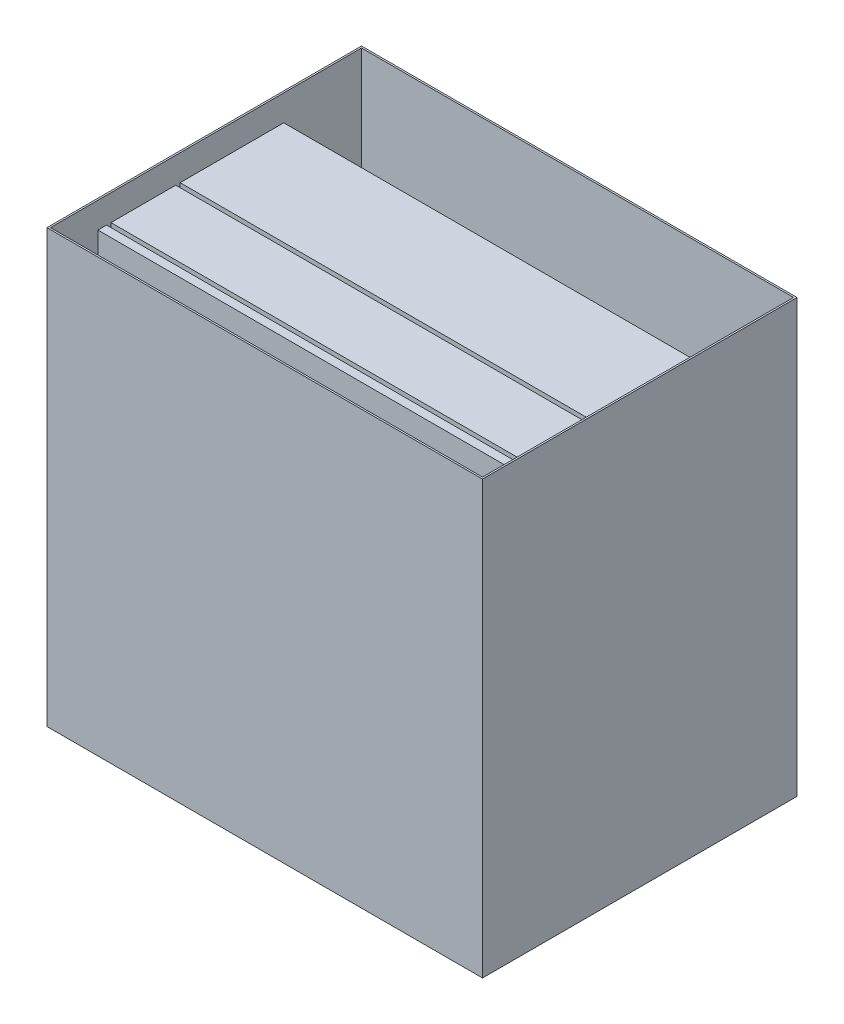
ISO-10303-21;
HEADER;
FILE_DESCRIPTION(('STEP AP214'),'2;1');
FILE_NAME('part.step','',(''),(''),'','','');
FILE_SCHEMA(('AUTOMOTIVE_DESIGN { 1 0 10303 214 1 1 1 1 }'));
ENDSEC;
DATA;
#1=APPLICATION_CONTEXT('core data for automotive mechanical design processes');
#2=APPLICATION_PROTOCOL_DEFINITION('international standard','automotive_design',2000,#1);
#3=PRODUCT_CONTEXT('',#1,'mechanical');
#4=PRODUCT('Part','Part','',(#3));
#5=PRODUCT_RELATED_PRODUCT_CATEGORY('part','',(#4));
#6=PRODUCT_DEFINITION_FORMATION('','',#4);
#7=PRODUCT_DEFINITION_CONTEXT('part definition',#1,'design');
#8=PRODUCT_DEFINITION('design','',#6,#7);
#9=PRODUCT_DEFINITION_SHAPE('','',#8);
#10=(LENGTH_UNIT() NAMED_UNIT(*) SI_UNIT(.MILLI.,.METRE.));
#11=(NAMED_UNIT(*) PLANE_ANGLE_UNIT() SI_UNIT($,.RADIAN.));
#12=(NAMED_UNIT(*) SI_UNIT($,.STERADIAN.) SOLID_ANGLE_UNIT());
#13=UNCERTAINTY_MEASURE_WITH_UNIT(LENGTH_MEASURE(1.E-05),#10,'distance_accuracy_value','');
#14=(GEOMETRIC_REPRESENTATION_CONTEXT(3) GLOBAL_UNCERTAINTY_ASSIGNED_CONTEXT((#13)) GLOBAL_UNIT_ASSIGNED_CONTEXT((#10,
#11,#12)) REPRESENTATION_CONTEXT('',''));
#15=CARTESIAN_POINT('',(0.,0.,0.));
#16=DIRECTION('',(0.,0.,1.));
#17=DIRECTION('',(1.,0.,0.));
#18=AXIS2_PLACEMENT_3D('',#15,#16,#17);
#19=CARTESIAN_POINT('',(320.04,330.2,330.247614288189));
#20=DIRECTION('',(1.,0.,0.));
#21=DIRECTION('',(0.,0.,-1.));
#22=AXIS2_PLACEMENT_3D('',#19,#20,#21);
#23=PLANE('',#22);
#24=DIRECTION('',(0.,0.,1.));
#25=VECTOR('',#24,1.);
#26=CARTESIAN_POINT('',(320.04,-304.8,330.247614288189));
#27=LINE('',#26,#25);
#28=CARTESIAN_POINT('',(320.04,-304.8,-129.492385711811));
#29=VERTEX_POINT('',#28);
#30=CARTESIAN_POINT('',(320.04,-304.8,332.787614288189));
#31=VERTEX_POINT('',#30);
#32=EDGE_CURVE('E166',#29,#31,#27,.T.);
#33=ORIENTED_EDGE('',*,*,#32,.F.);
#34=DIRECTION('',(0.,-1.,0.));
#35=VECTOR('',#34,1.);
#36=CARTESIAN_POINT('',(320.04,330.2,-129.492385711811));
#37=LINE('',#36,#35);
#38=CARTESIAN_POINT('',(320.04,330.2,-129.492385711811));
#39=VERTEX_POINT('',#38);
#40=EDGE_CURVE('E13',#39,#29,#37,.T.);
#41=ORIENTED_EDGE('',*,*,#40,.F.);
#42=DIRECTION('',(0.,0.,1.));
#43=VECTOR('',#42,1.);
#44=CARTESIAN_POINT('',(320.04,330.2,330.247614288189));
#45=LINE('',#44,#43);
#46=CARTESIAN_POINT('',(320.04,330.2,332.787614288189));
#47=VERTEX_POINT('',#46);
#48=EDGE_CURVE('E170',#39,#47,#45,.T.);
#49=ORIENTED_EDGE('',*,*,#48,.T.);
#50=DIRECTION('',(0.,-1.,0.));
#51=VECTOR('',#50,1.);
#52=CARTESIAN_POINT('',(320.04,330.2,332.787614288189));
#53=LINE('',#52,#51);
#54=EDGE_CURVE('E71',#47,#31,#53,.T.);
#55=ORIENTED_EDGE('',*,*,#54,.T.);
#56=EDGE_LOOP('',(#33,#41,#49,#55));
#57=FACE_BOUND('',#56,.T.);
#58=ADVANCED_FACE('F68',(#57),#23,.T.);
#59=CARTESIAN_POINT('',(-317.5,330.2,-129.492385711811));
#60=DIRECTION('',(0.,0.,-1.));
#61=DIRECTION('',(-1.,0.,0.));
#62=AXIS2_PLACEMENT_3D('',#59,#60,#61);
#63=PLANE('',#62);
#64=DIRECTION('',(1.,0.,0.));
#65=VECTOR('',#64,1.);
#66=CARTESIAN_POINT('',(-317.5,-304.8,-129.492385711811));
#67=LINE('',#66,#65);
#68=CARTESIAN_POINT('',(-320.04,-304.8,-129.492385711811));
#69=VERTEX_POINT('',#68);
#70=EDGE_CURVE('E174',#69,#29,#67,.T.);
#71=ORIENTED_EDGE('',*,*,#70,.F.);
#72=DIRECTION('',(0.,-1.,0.));
#73=VECTOR('',#72,1.);
#74=CARTESIAN_POINT('',(-320.04,330.2,-129.492385711811));
#75=LINE('',#74,#73);
#76=CARTESIAN_POINT('',(-320.04,330.2,-129.492385711811));
#77=VERTEX_POINT('',#76);
#78=EDGE_CURVE('E76',#77,#69,#75,.T.);
#79=ORIENTED_EDGE('',*,*,#78,.F.);
#80=DIRECTION('',(1.,0.,0.));
#81=VECTOR('',#80,1.);
#82=CARTESIAN_POINT('',(-317.5,330.2,-129.492385711811));
#83=LINE('',#82,#81);
#84=EDGE_CURVE('E180',#77,#39,#83,.T.);
#85=ORIENTED_EDGE('',*,*,#84,.T.);
#86=ORIENTED_EDGE('',*,*,#40,.T.);
#87=EDGE_LOOP('',(#71,#79,#85,#86));
#88=FACE_BOUND('',#87,.T.);
#89=ADVANCED_FACE('F206',(#88),#63,.T.);
#90=CARTESIAN_POINT('',(-320.04,330.2,330.247614288189));
#91=DIRECTION('',(-1.,0.,0.));
#92=DIRECTION('',(0.,0.,1.));
#93=AXIS2_PLACEMENT_3D('',#90,#91,#92);
#94=PLANE('',#93);
#95=DIRECTION('',(0.,0.,-1.));
#96=VECTOR('',#95,1.);
#97=CARTESIAN_POINT('',(-320.04,-304.8,330.247614288189));
#98=LINE('',#97,#96);
#99=CARTESIAN_POINT('',(-320.04,-304.8,332.787614288189));
#100=VERTEX_POINT('',#99);
#101=EDGE_CURVE('E188',#100,#69,#98,.T.);
#102=ORIENTED_EDGE('',*,*,#101,.F.);
#103=DIRECTION('',(0.,-1.,0.));
#104=VECTOR('',#103,1.);
#105=CARTESIAN_POINT('',(-320.04,330.2,332.787614288189));
#106=LINE('',#105,#104);
#107=CARTESIAN_POINT('',(-320.04,330.2,332.787614288189));
#108=VERTEX_POINT('',#107);
#109=EDGE_CURVE('E193',#108,#100,#106,.T.);
#110=ORIENTED_EDGE('',*,*,#109,.F.);
#111=DIRECTION('',(0.,0.,-1.));
#112=VECTOR('',#111,1.);
#113=CARTESIAN_POINT('',(-320.04,330.2,330.247614288189));
#114=LINE('',#113,#112);
#115=EDGE_CURVE('E177',#108,#77,#114,.T.);
#116=ORIENTED_EDGE('',*,*,#115,.T.);
#117=ORIENTED_EDGE('',*,*,#78,.T.);
#118=EDGE_LOOP('',(#102,#110,#116,#117));
#119=FACE_BOUND('',#118,.T.);
#120=ADVANCED_FACE('F210',(#119),#94,.T.);
#121=CARTESIAN_POINT('',(-317.5,330.2,332.787614288189));
#122=DIRECTION('',(0.,0.,1.));
#123=DIRECTION('',(1.,0.,0.));
#124=AXIS2_PLACEMENT_3D('',#121,#122,#123);
#125=PLANE('',#124);
#126=DIRECTION('',(-1.,0.,0.));
#127=VECTOR('',#126,1.);
#128=CARTESIAN_POINT('',(-317.5,-304.8,332.787614288189));
#129=LINE('',#128,#127);
#130=EDGE_CURVE('E185',#31,#100,#129,.T.);
#131=ORIENTED_EDGE('',*,*,#130,.F.);
#132=ORIENTED_EDGE('',*,*,#54,.F.);
#133=DIRECTION('',(-1.,0.,0.));
#134=VECTOR('',#133,1.);
#135=CARTESIAN_POINT('',(-317.5,330.2,332.787614288189));
#136=LINE('',#135,#134);
#137=EDGE_CURVE('E173',#47,#108,#136,.T.);
#138=ORIENTED_EDGE('',*,*,#137,.T.);
#139=ORIENTED_EDGE('',*,*,#109,.T.);
#140=EDGE_LOOP('',(#131,#132,#138,#139));
#141=FACE_BOUND('',#140,.T.);
#142=ADVANCED_FACE('F201',(#141),#125,.T.);
#143=CARTESIAN_POINT('',(0.,330.2,0.));
#144=DIRECTION('',(0.,-1.,0.));
#145=DIRECTION('',(0.,0.,-1.));
#146=AXIS2_PLACEMENT_3D('',#143,#144,#145);
#147=PLANE('',#146);
#148=DIRECTION('',(1.,0.,0.));
#149=VECTOR('',#148,1.);
#150=CARTESIAN_POINT('',(-317.5,330.2,-126.952385711811));
#151=LINE('',#150,#149);
#152=CARTESIAN_POINT('',(-317.5,330.2,-126.952385711811));
#153=VERTEX_POINT('',#152);
#154=CARTESIAN_POINT('',(317.5,330.2,-126.952385711811));
#155=VERTEX_POINT('',#154);
#156=EDGE_CURVE('E141',#153,#155,#151,.T.);
#157=ORIENTED_EDGE('',*,*,#156,.T.);
#158=DIRECTION('',(0.,0.,1.));
#159=VECTOR('',#158,1.);
#160=CARTESIAN_POINT('',(317.5,330.2,330.247614288189));
#161=LINE('',#160,#159);
#162=CARTESIAN_POINT('',(317.5,330.2,330.247614288189));
#163=VERTEX_POINT('',#162);
#164=EDGE_CURVE('E135',#155,#163,#161,.T.);
#165=ORIENTED_EDGE('',*,*,#164,.T.);
#166=DIRECTION('',(-1.,0.,0.));
#167=VECTOR('',#166,1.);
#168=CARTESIAN_POINT('',(-317.5,330.2,330.247614288189));
#169=LINE('',#168,#167);
#170=CARTESIAN_POINT('',(-317.5,330.2,330.247614288189));
#171=VERTEX_POINT('',#170);
#172=EDGE_CURVE('E144',#163,#171,#169,.T.);
#173=ORIENTED_EDGE('',*,*,#172,.T.);
#174=DIRECTION('',(0.,0.,-1.));
#175=VECTOR('',#174,1.);
#176=CARTESIAN_POINT('',(-317.5,330.2,330.247614288189));
#177=LINE('',#176,#175);
#178=EDGE_CURVE('E84',#171,#153,#177,.T.);
#179=ORIENTED_EDGE('',*,*,#178,.T.);
#180=EDGE_LOOP('',(#157,#165,#173,#179));
#181=FACE_BOUND('',#180,.T.);
#182=ORIENTED_EDGE('',*,*,#48,.F.);
#183=ORIENTED_EDGE('',*,*,#84,.F.);
#184=ORIENTED_EDGE('',*,*,#115,.F.);
#185=ORIENTED_EDGE('',*,*,#137,.F.);
#186=EDGE_LOOP('',(#182,#183,#184,#185));
#187=FACE_BOUND('',#186,.T.);
#188=ADVANCED_FACE('F148',(#181,#187),#147,.F.);
#189=CARTESIAN_POINT('',(0.,-304.8,0.));
#190=DIRECTION('',(0.,-1.,0.));
#191=DIRECTION('',(0.,0.,-1.));
#192=AXIS2_PLACEMENT_3D('',#189,#190,#191);
#193=PLANE('',#192);
#194=DIRECTION('',(0.,0.,1.));
#195=VECTOR('',#194,1.);
#196=CARTESIAN_POINT('',(317.5,-304.8,330.247614288189));
#197=LINE('',#196,#195);
#198=CARTESIAN_POINT('',(317.5,-304.8,-126.952385711811));
#199=VERTEX_POINT('',#198);
#200=CARTESIAN_POINT('',(317.5,-304.8,330.247614288189));
#201=VERTEX_POINT('',#200);
#202=EDGE_CURVE('E92',#199,#201,#197,.T.);
#203=ORIENTED_EDGE('',*,*,#202,.F.);
#204=DIRECTION('',(1.,0.,0.));
#205=VECTOR('',#204,1.);
#206=CARTESIAN_POINT('',(-317.5,-304.8,-126.952385711811));
#207=LINE('',#206,#205);
#208=CARTESIAN_POINT('',(-317.5,-304.8,-126.952385711811));
#209=VERTEX_POINT('',#208);
#210=EDGE_CURVE('E151',#209,#199,#207,.T.);
#211=ORIENTED_EDGE('',*,*,#210,.F.);
#212=DIRECTION('',(0.,0.,-1.));
#213=VECTOR('',#212,1.);
#214=CARTESIAN_POINT('',(-317.5,-304.8,330.247614288189));
#215=LINE('',#214,#213);
#216=CARTESIAN_POINT('',(-317.5,-304.8,330.247614288189));
#217=VERTEX_POINT('',#216);
#218=EDGE_CURVE('E154',#217,#209,#215,.T.);
#219=ORIENTED_EDGE('',*,*,#218,.F.);
#220=DIRECTION('',(-1.,0.,0.));
#221=VECTOR('',#220,1.);
#222=CARTESIAN_POINT('',(-317.5,-304.8,330.247614288189));
#223=LINE('',#222,#221);
#224=EDGE_CURVE('E160',#201,#217,#223,.T.);
#225=ORIENTED_EDGE('',*,*,#224,.F.);
#226=EDGE_LOOP('',(#203,#211,#219,#225));
#227=FACE_BOUND('',#226,.T.);
#228=ORIENTED_EDGE('',*,*,#32,.T.);
#229=ORIENTED_EDGE('',*,*,#130,.T.);
#230=ORIENTED_EDGE('',*,*,#101,.T.);
#231=ORIENTED_EDGE('',*,*,#70,.T.);
#232=EDGE_LOOP('',(#228,#229,#230,#231));
#233=FACE_BOUND('',#232,.T.);
#234=ADVANCED_FACE('F203',(#227,#233),#193,.T.);
#235=CARTESIAN_POINT('',(317.5,330.2,330.247614288189));
#236=DIRECTION('',(1.,0.,0.));
#237=DIRECTION('',(0.,0.,-1.));
#238=AXIS2_PLACEMENT_3D('',#235,#236,#237);
#239=PLANE('',#238);
#240=ORIENTED_EDGE('',*,*,#202,.T.);
#241=DIRECTION('',(0.,-1.,0.));
#242=VECTOR('',#241,1.);
#243=CARTESIAN_POINT('',(317.5,330.2,330.247614288189));
#244=LINE('',#243,#242);
#245=EDGE_CURVE('E131',#163,#201,#244,.T.);
#246=ORIENTED_EDGE('',*,*,#245,.F.);
#247=ORIENTED_EDGE('',*,*,#164,.F.);
#248=DIRECTION('',(0.,-1.,0.));
#249=VECTOR('',#248,1.);
#250=CARTESIAN_POINT('',(317.5,330.2,-126.952385711811));
#251=LINE('',#250,#249);
#252=EDGE_CURVE('E164',#155,#199,#251,.T.);
#253=ORIENTED_EDGE('',*,*,#252,.T.);
#254=EDGE_LOOP('',(#240,#246,#247,#253));
#255=FACE_BOUND('',#254,.T.);
#256=ADVANCED_FACE('F133',(#255),#239,.F.);
#257=CARTESIAN_POINT('',(-317.5,330.2,-126.952385711811));
#258=DIRECTION('',(0.,0.,-1.));
#259=DIRECTION('',(-1.,0.,0.));
#260=AXIS2_PLACEMENT_3D('',#257,#258,#259);
#261=PLANE('',#260);
#262=ORIENTED_EDGE('',*,*,#210,.T.);
#263=ORIENTED_EDGE('',*,*,#252,.F.);
#264=ORIENTED_EDGE('',*,*,#156,.F.);
#265=DIRECTION('',(0.,-1.,0.));
#266=VECTOR('',#265,1.);
#267=CARTESIAN_POINT('',(-317.5,330.2,-126.952385711811));
#268=LINE('',#267,#266);
#269=EDGE_CURVE('E167',#153,#209,#268,.T.);
#270=ORIENTED_EDGE('',*,*,#269,.T.);
#271=EDGE_LOOP('',(#262,#263,#264,#270));
#272=FACE_BOUND('',#271,.T.);
#273=ADVANCED_FACE('F261',(#272),#261,.F.);
#274=CARTESIAN_POINT('',(-317.5,330.2,330.247614288189));
#275=DIRECTION('',(-1.,0.,0.));
#276=DIRECTION('',(0.,0.,1.));
#277=AXIS2_PLACEMENT_3D('',#274,#275,#276);
#278=PLANE('',#277);
#279=ORIENTED_EDGE('',*,*,#218,.T.);
#280=ORIENTED_EDGE('',*,*,#269,.F.);
#281=ORIENTED_EDGE('',*,*,#178,.F.);
#282=DIRECTION('',(0.,-1.,0.));
#283=VECTOR('',#282,1.);
#284=CARTESIAN_POINT('',(-317.5,330.2,330.247614288189));
#285=LINE('',#284,#283);
#286=EDGE_CURVE('E140',#171,#217,#285,.T.);
#287=ORIENTED_EDGE('',*,*,#286,.T.);
#288=EDGE_LOOP('',(#279,#280,#281,#287));
#289=FACE_BOUND('',#288,.T.);
#290=ADVANCED_FACE('F270',(#289),#278,.F.);
#291=CARTESIAN_POINT('',(-317.5,330.2,330.247614288189));
#292=DIRECTION('',(0.,0.,1.));
#293=DIRECTION('',(1.,0.,0.));
#294=AXIS2_PLACEMENT_3D('',#291,#292,#293);
#295=PLANE('',#294);
#296=ORIENTED_EDGE('',*,*,#224,.T.);
#297=ORIENTED_EDGE('',*,*,#286,.F.);
#298=ORIENTED_EDGE('',*,*,#172,.F.);
#299=ORIENTED_EDGE('',*,*,#245,.T.);
#300=EDGE_LOOP('',(#296,#297,#298,#299));
#301=FACE_BOUND('',#300,.T.);
#302=ADVANCED_FACE('F145',(#301),#295,.F.);
#303=CLOSED_SHELL('',(#58,#89,#120,#142,#188,#234,#256,#273,#290,#302));
#304=MANIFOLD_SOLID_BREP('B2',#303);
#305=CARTESIAN_POINT('',(304.8,-304.8,273.05));
#306=DIRECTION('',(-1.,0.,0.));
#307=DIRECTION('',(0.,0.,1.));
#308=AXIS2_PLACEMENT_3D('',#305,#306,#307);
#309=PLANE('',#308);
#310=DIRECTION('',(0.,1.,0.));
#311=VECTOR('',#310,1.);
#312=CARTESIAN_POINT('',(304.8,-304.8,260.35));
#313=LINE('',#312,#311);
#314=CARTESIAN_POINT('',(304.8,-304.8,260.35));
#315=VERTEX_POINT('',#314);
#316=CARTESIAN_POINT('',(304.8,304.8,260.35));
#317=VERTEX_POINT('',#316);
#318=EDGE_CURVE('E371',#315,#317,#313,.T.);
#319=ORIENTED_EDGE('',*,*,#318,.T.);
#320=DIRECTION('',(0.,0.,-1.));
#321=VECTOR('',#320,1.);
#322=CARTESIAN_POINT('',(304.8,304.8,273.05));
#323=LINE('',#322,#321);
#324=CARTESIAN_POINT('',(304.8,304.8,273.05));
#325=VERTEX_POINT('',#324);
#326=EDGE_CURVE('E66',#325,#317,#323,.T.);
#327=ORIENTED_EDGE('',*,*,#326,.F.);
#328=DIRECTION('',(0.,1.,0.));
#329=VECTOR('',#328,1.);
#330=CARTESIAN_POINT('',(304.8,-304.8,273.05));
#331=LINE('',#330,#329);
#332=CARTESIAN_POINT('',(304.8,-304.8,273.05));
#333=VERTEX_POINT('',#332);
#334=EDGE_CURVE('E359',#333,#325,#331,.T.);
#335=ORIENTED_EDGE('',*,*,#334,.F.);
#336=DIRECTION('',(0.,0.,-1.));
#337=VECTOR('',#336,1.);
#338=CARTESIAN_POINT('',(304.8,-304.8,273.05));
#339=LINE('',#338,#337);
#340=EDGE_CURVE('E367',#333,#315,#339,.T.);
#341=ORIENTED_EDGE('',*,*,#340,.T.);
#342=EDGE_LOOP('',(#319,#327,#335,#341));
#343=FACE_BOUND('',#342,.T.);
#344=ADVANCED_FACE('F308',(#343),#309,.F.);
#345=CARTESIAN_POINT('',(-304.8,304.8,273.05));
#346=DIRECTION('',(0.,-1.,0.));
#347=DIRECTION('',(0.,0.,-1.));
#348=AXIS2_PLACEMENT_3D('',#345,#346,#347);
#349=PLANE('',#348);
#350=DIRECTION('',(-1.,0.,0.));
#351=VECTOR('',#350,1.);
#352=CARTESIAN_POINT('',(-304.8,304.8,260.35));
#353=LINE('',#352,#351);
#354=CARTESIAN_POINT('',(-304.8,304.8,260.35));
#355=VERTEX_POINT('',#354);
#356=EDGE_CURVE('E363',#317,#355,#353,.T.);
#357=ORIENTED_EDGE('',*,*,#356,.T.);
#358=DIRECTION('',(0.,0.,-1.));
#359=VECTOR('',#358,1.);
#360=CARTESIAN_POINT('',(-304.8,304.8,273.05));
#361=LINE('',#360,#359);
#362=CARTESIAN_POINT('',(-304.8,304.8,273.05));
#363=VERTEX_POINT('',#362);
#364=EDGE_CURVE('E316',#363,#355,#361,.T.);
#365=ORIENTED_EDGE('',*,*,#364,.F.);
#366=DIRECTION('',(-1.,0.,0.));
#367=VECTOR('',#366,1.);
#368=CARTESIAN_POINT('',(-304.8,304.8,273.05));
#369=LINE('',#368,#367);
#370=EDGE_CURVE('E354',#325,#363,#369,.T.);
#371=ORIENTED_EDGE('',*,*,#370,.F.);
#372=ORIENTED_EDGE('',*,*,#326,.T.);
#373=EDGE_LOOP('',(#357,#365,#371,#372));
#374=FACE_BOUND('',#373,.T.);
#375=ADVANCED_FACE('F362',(#374),#349,.F.);
#376=CARTESIAN_POINT('',(-304.8,-304.8,273.05));
#377=DIRECTION('',(1.,0.,0.));
#378=DIRECTION('',(0.,0.,-1.));
#379=AXIS2_PLACEMENT_3D('',#376,#377,#378);
#380=PLANE('',#379);
#381=DIRECTION('',(0.,-1.,0.));
#382=VECTOR('',#381,1.);
#383=CARTESIAN_POINT('',(-304.8,-304.8,260.35));
#384=LINE('',#383,#382);
#385=CARTESIAN_POINT('',(-304.8,-304.8,260.35));
#386=VERTEX_POINT('',#385);
#387=EDGE_CURVE('E341',#355,#386,#384,.T.);
#388=ORIENTED_EDGE('',*,*,#387,.T.);
#389=DIRECTION('',(0.,0.,-1.));
#390=VECTOR('',#389,1.);
#391=CARTESIAN_POINT('',(-304.8,-304.8,273.05));
#392=LINE('',#391,#390);
#393=CARTESIAN_POINT('',(-304.8,-304.8,273.05));
#394=VERTEX_POINT('',#393);
#395=EDGE_CURVE('E364',#394,#386,#392,.T.);
#396=ORIENTED_EDGE('',*,*,#395,.F.);
#397=DIRECTION('',(0.,-1.,0.));
#398=VECTOR('',#397,1.);
#399=CARTESIAN_POINT('',(-304.8,-304.8,273.05));
#400=LINE('',#399,#398);
#401=EDGE_CURVE('E357',#363,#394,#400,.T.);
#402=ORIENTED_EDGE('',*,*,#401,.F.);
#403=ORIENTED_EDGE('',*,*,#364,.T.);
#404=EDGE_LOOP('',(#388,#396,#402,#403));
#405=FACE_BOUND('',#404,.T.);
#406=ADVANCED_FACE('F365',(#405),#380,.F.);
#407=CARTESIAN_POINT('',(-304.8,-304.8,273.05));
#408=DIRECTION('',(0.,1.,0.));
#409=DIRECTION('',(0.,0.,1.));
#410=AXIS2_PLACEMENT_3D('',#407,#408,#409);
#411=PLANE('',#410);
#412=DIRECTION('',(1.,0.,0.));
#413=VECTOR('',#412,1.);
#414=CARTESIAN_POINT('',(-304.8,-304.8,260.35));
#415=LINE('',#414,#413);
#416=EDGE_CURVE('E347',#386,#315,#415,.T.);
#417=ORIENTED_EDGE('',*,*,#416,.T.);
#418=ORIENTED_EDGE('',*,*,#340,.F.);
#419=DIRECTION('',(1.,0.,0.));
#420=VECTOR('',#419,1.);
#421=CARTESIAN_POINT('',(-304.8,-304.8,273.05));
#422=LINE('',#421,#420);
#423=EDGE_CURVE('E324',#394,#333,#422,.T.);
#424=ORIENTED_EDGE('',*,*,#423,.F.);
#425=ORIENTED_EDGE('',*,*,#395,.T.);
#426=EDGE_LOOP('',(#417,#418,#424,#425));
#427=FACE_BOUND('',#426,.T.);
#428=ADVANCED_FACE('F378',(#427),#411,.F.);
#429=CARTESIAN_POINT('',(0.,0.,273.05));
#430=DIRECTION('',(0.,0.,-1.));
#431=DIRECTION('',(-1.,0.,0.));
#432=AXIS2_PLACEMENT_3D('',#429,#430,#431);
#433=PLANE('',#432);
#434=ORIENTED_EDGE('',*,*,#334,.T.);
#435=ORIENTED_EDGE('',*,*,#370,.T.);
#436=ORIENTED_EDGE('',*,*,#401,.T.);
#437=ORIENTED_EDGE('',*,*,#423,.T.);
#438=EDGE_LOOP('',(#434,#435,#436,#437));
#439=FACE_BOUND('',#438,.T.);
#440=ADVANCED_FACE('F355',(#439),#433,.F.);
#441=CARTESIAN_POINT('',(0.,0.,260.35));
#442=DIRECTION('',(0.,0.,-1.));
#443=DIRECTION('',(-1.,0.,0.));
#444=AXIS2_PLACEMENT_3D('',#441,#442,#443);
#445=PLANE('',#444);
#446=ORIENTED_EDGE('',*,*,#318,.F.);
#447=ORIENTED_EDGE('',*,*,#416,.F.);
#448=ORIENTED_EDGE('',*,*,#387,.F.);
#449=ORIENTED_EDGE('',*,*,#356,.F.);
#450=EDGE_LOOP('',(#446,#447,#448,#449));
#451=FACE_BOUND('',#450,.T.);
#452=ADVANCED_FACE('F381',(#451),#445,.T.);
#453=CLOSED_SHELL('',(#344,#375,#406,#428,#440,#452));
#454=MANIFOLD_SOLID_BREP('B7',#453);
#455=CARTESIAN_POINT('',(304.8,-304.8,254.));
#456=DIRECTION('',(-1.,0.,0.));
#457=DIRECTION('',(0.,0.,1.));
#458=AXIS2_PLACEMENT_3D('',#455,#456,#457);
#459=PLANE('',#458);
#460=DIRECTION('',(0.,1.,0.));
#461=VECTOR('',#460,1.);
#462=CARTESIAN_POINT('',(304.8,-304.8,158.75));
#463=LINE('',#462,#461);
#464=CARTESIAN_POINT('',(304.8,-304.8,158.75));
#465=VERTEX_POINT('',#464);
#466=CARTESIAN_POINT('',(304.8,304.8,158.75));
#467=VERTEX_POINT('',#466);
#468=EDGE_CURVE('E504',#465,#467,#463,.T.);
#469=ORIENTED_EDGE('',*,*,#468,.T.);
#470=DIRECTION('',(0.,0.,-1.));
#471=VECTOR('',#470,1.);
#472=CARTESIAN_POINT('',(304.8,304.8,254.));
#473=LINE('',#472,#471);
#474=CARTESIAN_POINT('',(304.8,304.8,254.));
#475=VERTEX_POINT('',#474);
#476=EDGE_CURVE('E306',#475,#467,#473,.T.);
#477=ORIENTED_EDGE('',*,*,#476,.F.);
#478=DIRECTION('',(0.,1.,0.));
#479=VECTOR('',#478,1.);
#480=CARTESIAN_POINT('',(304.8,-304.8,254.));
#481=LINE('',#480,#479);
#482=CARTESIAN_POINT('',(304.8,-304.8,254.));
#483=VERTEX_POINT('',#482);
#484=EDGE_CURVE('E492',#483,#475,#481,.T.);
#485=ORIENTED_EDGE('',*,*,#484,.F.);
#486=DIRECTION('',(0.,0.,-1.));
#487=VECTOR('',#486,1.);
#488=CARTESIAN_POINT('',(304.8,-304.8,254.));
#489=LINE('',#488,#487);
#490=EDGE_CURVE('E500',#483,#465,#489,.T.);
#491=ORIENTED_EDGE('',*,*,#490,.T.);
#492=EDGE_LOOP('',(#469,#477,#485,#491));
#493=FACE_BOUND('',#492,.T.);
#494=ADVANCED_FACE('F441',(#493),#459,.F.);
#495=CARTESIAN_POINT('',(-304.8,304.8,254.));
#496=DIRECTION('',(0.,-1.,0.));
#497=DIRECTION('',(0.,0.,-1.));
#498=AXIS2_PLACEMENT_3D('',#495,#496,#497);
#499=PLANE('',#498);
#500=DIRECTION('',(-1.,0.,0.));
#501=VECTOR('',#500,1.);
#502=CARTESIAN_POINT('',(-304.8,304.8,158.75));
#503=LINE('',#502,#501);
#504=CARTESIAN_POINT('',(-304.8,304.8,158.75));
#505=VERTEX_POINT('',#504);
#506=EDGE_CURVE('E496',#467,#505,#503,.T.);
#507=ORIENTED_EDGE('',*,*,#506,.T.);
#508=DIRECTION('',(0.,0.,-1.));
#509=VECTOR('',#508,1.);
#510=CARTESIAN_POINT('',(-304.8,304.8,254.));
#511=LINE('',#510,#509);
#512=CARTESIAN_POINT('',(-304.8,304.8,254.));
#513=VERTEX_POINT('',#512);
#514=EDGE_CURVE('E449',#513,#505,#511,.T.);
#515=ORIENTED_EDGE('',*,*,#514,.F.);
#516=DIRECTION('',(-1.,0.,0.));
#517=VECTOR('',#516,1.);
#518=CARTESIAN_POINT('',(-304.8,304.8,254.));
#519=LINE('',#518,#517);
#520=EDGE_CURVE('E487',#475,#513,#519,.T.);
#521=ORIENTED_EDGE('',*,*,#520,.F.);
#522=ORIENTED_EDGE('',*,*,#476,.T.);
#523=EDGE_LOOP('',(#507,#515,#521,#522));
#524=FACE_BOUND('',#523,.T.);
#525=ADVANCED_FACE('F495',(#524),#499,.F.);
#526=CARTESIAN_POINT('',(-304.8,-304.8,254.));
#527=DIRECTION('',(1.,0.,0.));
#528=DIRECTION('',(0.,0.,-1.));
#529=AXIS2_PLACEMENT_3D('',#526,#527,#528);
#530=PLANE('',#529);
#531=DIRECTION('',(0.,-1.,0.));
#532=VECTOR('',#531,1.);
#533=CARTESIAN_POINT('',(-304.8,-304.8,158.75));
#534=LINE('',#533,#532);
#535=CARTESIAN_POINT('',(-304.8,-304.8,158.75));
#536=VERTEX_POINT('',#535);
#537=EDGE_CURVE('E474',#505,#536,#534,.T.);
#538=ORIENTED_EDGE('',*,*,#537,.T.);
#539=DIRECTION('',(0.,0.,-1.));
#540=VECTOR('',#539,1.);
#541=CARTESIAN_POINT('',(-304.8,-304.8,254.));
#542=LINE('',#541,#540);
#543=CARTESIAN_POINT('',(-304.8,-304.8,254.));
#544=VERTEX_POINT('',#543);
#545=EDGE_CURVE('E497',#544,#536,#542,.T.);
#546=ORIENTED_EDGE('',*,*,#545,.F.);
#547=DIRECTION('',(0.,-1.,0.));
#548=VECTOR('',#547,1.);
#549=CARTESIAN_POINT('',(-304.8,-304.8,254.));
#550=LINE('',#549,#548);
#551=EDGE_CURVE('E490',#513,#544,#550,.T.);
#552=ORIENTED_EDGE('',*,*,#551,.F.);
#553=ORIENTED_EDGE('',*,*,#514,.T.);
#554=EDGE_LOOP('',(#538,#546,#552,#553));
#555=FACE_BOUND('',#554,.T.);
#556=ADVANCED_FACE('F498',(#555),#530,.F.);
#557=CARTESIAN_POINT('',(-304.8,-304.8,254.));
#558=DIRECTION('',(0.,1.,0.));
#559=DIRECTION('',(0.,0.,1.));
#560=AXIS2_PLACEMENT_3D('',#557,#558,#559);
#561=PLANE('',#560);
#562=DIRECTION('',(1.,0.,0.));
#563=VECTOR('',#562,1.);
#564=CARTESIAN_POINT('',(-304.8,-304.8,158.75));
#565=LINE('',#564,#563);
#566=EDGE_CURVE('E480',#536,#465,#565,.T.);
#567=ORIENTED_EDGE('',*,*,#566,.T.);
#568=ORIENTED_EDGE('',*,*,#490,.F.);
#569=DIRECTION('',(1.,0.,0.));
#570=VECTOR('',#569,1.);
#571=CARTESIAN_POINT('',(-304.8,-304.8,254.));
#572=LINE('',#571,#570);
#573=EDGE_CURVE('E457',#544,#483,#572,.T.);
#574=ORIENTED_EDGE('',*,*,#573,.F.);
#575=ORIENTED_EDGE('',*,*,#545,.T.);
#576=EDGE_LOOP('',(#567,#568,#574,#575));
#577=FACE_BOUND('',#576,.T.);
#578=ADVANCED_FACE('F511',(#577),#561,.F.);
#579=CARTESIAN_POINT('',(0.,0.,254.));
#580=DIRECTION('',(0.,0.,-1.));
#581=DIRECTION('',(-1.,0.,0.));
#582=AXIS2_PLACEMENT_3D('',#579,#580,#581);
#583=PLANE('',#582);
#584=ORIENTED_EDGE('',*,*,#484,.T.);
#585=ORIENTED_EDGE('',*,*,#520,.T.);
#586=ORIENTED_EDGE('',*,*,#551,.T.);
#587=ORIENTED_EDGE('',*,*,#573,.T.);
#588=EDGE_LOOP('',(#584,#585,#586,#587));
#589=FACE_BOUND('',#588,.T.);
#590=ADVANCED_FACE('F488',(#589),#583,.F.);
#591=CARTESIAN_POINT('',(0.,0.,158.75));
#592=DIRECTION('',(0.,0.,-1.));
#593=DIRECTION('',(-1.,0.,0.));
#594=AXIS2_PLACEMENT_3D('',#591,#592,#593);
#595=PLANE('',#594);
#596=ORIENTED_EDGE('',*,*,#468,.F.);
#597=ORIENTED_EDGE('',*,*,#566,.F.);
#598=ORIENTED_EDGE('',*,*,#537,.F.);
#599=ORIENTED_EDGE('',*,*,#506,.F.);
#600=EDGE_LOOP('',(#596,#597,#598,#599));
#601=FACE_BOUND('',#600,.T.);
#602=ADVANCED_FACE('F514',(#601),#595,.T.);
#603=CLOSED_SHELL('',(#494,#525,#556,#578,#590,#602));
#604=MANIFOLD_SOLID_BREP('B60',#603);
#605=CARTESIAN_POINT('',(304.8,304.8,152.4));
#606=DIRECTION('',(-1.,0.,0.));
#607=DIRECTION('',(0.,-1.,0.));
#608=AXIS2_PLACEMENT_3D('',#605,#606,#607);
#609=PLANE('',#608);
#610=DIRECTION('',(0.,1.,0.));
#611=VECTOR('',#610,1.);
#612=CARTESIAN_POINT('',(304.8,304.8,0.));
#613=LINE('',#612,#611);
#614=CARTESIAN_POINT('',(304.8,-304.8,0.));
#615=VERTEX_POINT('',#614);
#616=CARTESIAN_POINT('',(304.8,304.8,0.));
#617=VERTEX_POINT('',#616);
#618=EDGE_CURVE('E628',#615,#617,#613,.T.);
#619=ORIENTED_EDGE('',*,*,#618,.T.);
#620=DIRECTION('',(0.,0.,-1.));
#621=VECTOR('',#620,1.);
#622=CARTESIAN_POINT('',(304.8,304.8,152.4));
#623=LINE('',#622,#621);
#624=CARTESIAN_POINT('',(304.8,304.8,152.4));
#625=VERTEX_POINT('',#624);
#626=EDGE_CURVE('E439',#625,#617,#623,.T.);
#627=ORIENTED_EDGE('',*,*,#626,.F.);
#628=DIRECTION('',(0.,1.,0.));
#629=VECTOR('',#628,1.);
#630=CARTESIAN_POINT('',(304.8,304.8,152.4));
#631=LINE('',#630,#629);
#632=CARTESIAN_POINT('',(304.8,-304.8,152.4));
#633=VERTEX_POINT('',#632);
#634=EDGE_CURVE('E616',#633,#625,#631,.T.);
#635=ORIENTED_EDGE('',*,*,#634,.F.);
#636=DIRECTION('',(0.,0.,-1.));
#637=VECTOR('',#636,1.);
#638=CARTESIAN_POINT('',(304.8,-304.8,152.4));
#639=LINE('',#638,#637);
#640=EDGE_CURVE('E624',#633,#615,#639,.T.);
#641=ORIENTED_EDGE('',*,*,#640,.T.);
#642=EDGE_LOOP('',(#619,#627,#635,#641));
#643=FACE_BOUND('',#642,.T.);
#644=ADVANCED_FACE('F565',(#643),#609,.F.);
#645=CARTESIAN_POINT('',(-304.8,304.8,152.4));
#646=DIRECTION('',(0.,-1.,0.));
#647=DIRECTION('',(0.,0.,-1.));
#648=AXIS2_PLACEMENT_3D('',#645,#646,#647);
#649=PLANE('',#648);
#650=DIRECTION('',(-1.,0.,0.));
#651=VECTOR('',#650,1.);
#652=CARTESIAN_POINT('',(-304.8,304.8,0.));
#653=LINE('',#652,#651);
#654=CARTESIAN_POINT('',(-304.8,304.8,0.));
#655=VERTEX_POINT('',#654);
#656=EDGE_CURVE('E620',#617,#655,#653,.T.);
#657=ORIENTED_EDGE('',*,*,#656,.T.);
#658=DIRECTION('',(0.,0.,-1.));
#659=VECTOR('',#658,1.);
#660=CARTESIAN_POINT('',(-304.8,304.8,152.4));
#661=LINE('',#660,#659);
#662=CARTESIAN_POINT('',(-304.8,304.8,152.4));
#663=VERTEX_POINT('',#662);
#664=EDGE_CURVE('E573',#663,#655,#661,.T.);
#665=ORIENTED_EDGE('',*,*,#664,.F.);
#666=DIRECTION('',(-1.,0.,0.));
#667=VECTOR('',#666,1.);
#668=CARTESIAN_POINT('',(-304.8,304.8,152.4));
#669=LINE('',#668,#667);
#670=EDGE_CURVE('E611',#625,#663,#669,.T.);
#671=ORIENTED_EDGE('',*,*,#670,.F.);
#672=ORIENTED_EDGE('',*,*,#626,.T.);
#673=EDGE_LOOP('',(#657,#665,#671,#672));
#674=FACE_BOUND('',#673,.T.);
#675=ADVANCED_FACE('F619',(#674),#649,.F.);
#676=CARTESIAN_POINT('',(-304.8,304.8,152.4));
#677=DIRECTION('',(1.,0.,0.));
#678=DIRECTION('',(0.,1.,0.));
#679=AXIS2_PLACEMENT_3D('',#676,#677,#678);
#680=PLANE('',#679);
#681=DIRECTION('',(0.,-1.,0.));
#682=VECTOR('',#681,1.);
#683=CARTESIAN_POINT('',(-304.8,304.8,0.));
#684=LINE('',#683,#682);
#685=CARTESIAN_POINT('',(-304.8,-304.8,0.));
#686=VERTEX_POINT('',#685);
#687=EDGE_CURVE('E598',#655,#686,#684,.T.);
#688=ORIENTED_EDGE('',*,*,#687,.T.);
#689=DIRECTION('',(0.,0.,-1.));
#690=VECTOR('',#689,1.);
#691=CARTESIAN_POINT('',(-304.8,-304.8,152.4));
#692=LINE('',#691,#690);
#693=CARTESIAN_POINT('',(-304.8,-304.8,152.4));
#694=VERTEX_POINT('',#693);
#695=EDGE_CURVE('E621',#694,#686,#692,.T.);
#696=ORIENTED_EDGE('',*,*,#695,.F.);
#697=DIRECTION('',(0.,-1.,0.));
#698=VECTOR('',#697,1.);
#699=CARTESIAN_POINT('',(-304.8,304.8,152.4));
#700=LINE('',#699,#698);
#701=EDGE_CURVE('E614',#663,#694,#700,.T.);
#702=ORIENTED_EDGE('',*,*,#701,.F.);
#703=ORIENTED_EDGE('',*,*,#664,.T.);
#704=EDGE_LOOP('',(#688,#696,#702,#703));
#705=FACE_BOUND('',#704,.T.);
#706=ADVANCED_FACE('F622',(#705),#680,.F.);
#707=CARTESIAN_POINT('',(-304.8,-304.8,152.4));
#708=DIRECTION('',(0.,1.,0.));
#709=DIRECTION('',(0.,0.,1.));
#710=AXIS2_PLACEMENT_3D('',#707,#708,#709);
#711=PLANE('',#710);
#712=DIRECTION('',(1.,0.,0.));
#713=VECTOR('',#712,1.);
#714=CARTESIAN_POINT('',(-304.8,-304.8,0.));
#715=LINE('',#714,#713);
#716=EDGE_CURVE('E604',#686,#615,#715,.T.);
#717=ORIENTED_EDGE('',*,*,#716,.T.);
#718=ORIENTED_EDGE('',*,*,#640,.F.);
#719=DIRECTION('',(1.,0.,0.));
#720=VECTOR('',#719,1.);
#721=CARTESIAN_POINT('',(-304.8,-304.8,152.4));
#722=LINE('',#721,#720);
#723=EDGE_CURVE('E581',#694,#633,#722,.T.);
#724=ORIENTED_EDGE('',*,*,#723,.F.);
#725=ORIENTED_EDGE('',*,*,#695,.T.);
#726=EDGE_LOOP('',(#717,#718,#724,#725));
#727=FACE_BOUND('',#726,.T.);
#728=ADVANCED_FACE('F635',(#727),#711,.F.);
#729=CARTESIAN_POINT('',(0.,0.,152.4));
#730=DIRECTION('',(0.,0.,1.));
#731=DIRECTION('',(1.,0.,0.));
#732=AXIS2_PLACEMENT_3D('',#729,#730,#731);
#733=PLANE('',#732);
#734=ORIENTED_EDGE('',*,*,#634,.T.);
#735=ORIENTED_EDGE('',*,*,#670,.T.);
#736=ORIENTED_EDGE('',*,*,#701,.T.);
#737=ORIENTED_EDGE('',*,*,#723,.T.);
#738=EDGE_LOOP('',(#734,#735,#736,#737));
#739=FACE_BOUND('',#738,.T.);
#740=ADVANCED_FACE('F612',(#739),#733,.T.);
#741=CARTESIAN_POINT('',(0.,0.,0.));
#742=DIRECTION('',(0.,0.,1.));
#743=DIRECTION('',(1.,0.,0.));
#744=AXIS2_PLACEMENT_3D('',#741,#742,#743);
#745=PLANE('',#744);
#746=ORIENTED_EDGE('',*,*,#618,.F.);
#747=ORIENTED_EDGE('',*,*,#716,.F.);
#748=ORIENTED_EDGE('',*,*,#687,.F.);
#749=ORIENTED_EDGE('',*,*,#656,.F.);
#750=EDGE_LOOP('',(#746,#747,#748,#749));
#751=FACE_BOUND('',#750,.T.);
#752=ADVANCED_FACE('F638',(#751),#745,.F.);
#753=CLOSED_SHELL('',(#644,#675,#706,#728,#740,#752));
#754=MANIFOLD_SOLID_BREP('B300',#753);
#755=ADVANCED_BREP_SHAPE_REPRESENTATION('',(#18,#304,#454,#604,#754),#14);
#756=SHAPE_DEFINITION_REPRESENTATION(#9,#755);
ENDSEC;
END-ISO-10303-21;
